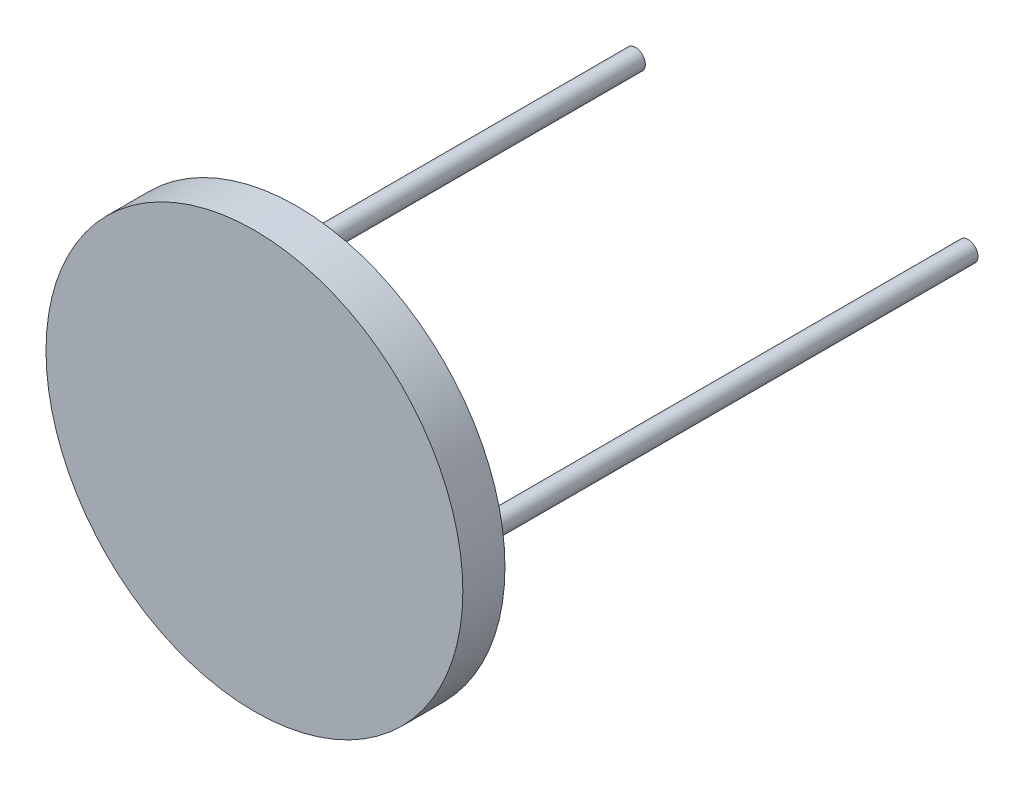
ISO-10303-21;
HEADER;
FILE_DESCRIPTION(('STEP AP214'),'2;1');
FILE_NAME('part.step','',(''),(''),'','','');
FILE_SCHEMA(('AUTOMOTIVE_DESIGN { 1 0 10303 214 1 1 1 1 }'));
ENDSEC;
DATA;
#1=APPLICATION_CONTEXT('core data for automotive mechanical design processes');
#2=APPLICATION_PROTOCOL_DEFINITION('international standard','automotive_design',2000,#1);
#3=PRODUCT_CONTEXT('',#1,'mechanical');
#4=PRODUCT('Part','Part','',(#3));
#5=PRODUCT_RELATED_PRODUCT_CATEGORY('part','',(#4));
#6=PRODUCT_DEFINITION_FORMATION('','',#4);
#7=PRODUCT_DEFINITION_CONTEXT('part definition',#1,'design');
#8=PRODUCT_DEFINITION('design','',#6,#7);
#9=PRODUCT_DEFINITION_SHAPE('','',#8);
#10=(LENGTH_UNIT() NAMED_UNIT(*) SI_UNIT(.MILLI.,.METRE.));
#11=(NAMED_UNIT(*) PLANE_ANGLE_UNIT() SI_UNIT($,.RADIAN.));
#12=(NAMED_UNIT(*) SI_UNIT($,.STERADIAN.) SOLID_ANGLE_UNIT());
#13=UNCERTAINTY_MEASURE_WITH_UNIT(LENGTH_MEASURE(1.E-05),#10,'distance_accuracy_value','');
#14=(GEOMETRIC_REPRESENTATION_CONTEXT(3) GLOBAL_UNCERTAINTY_ASSIGNED_CONTEXT((#13)) GLOBAL_UNIT_ASSIGNED_CONTEXT((#10,
#11,#12)) REPRESENTATION_CONTEXT('',''));
#15=CARTESIAN_POINT('',(0.,0.,0.));
#16=DIRECTION('',(0.,0.,1.));
#17=DIRECTION('',(1.,0.,0.));
#18=AXIS2_PLACEMENT_3D('',#15,#16,#17);
#19=CARTESIAN_POINT('',(0.,0.,2.));
#20=DIRECTION('',(0.,0.,-1.));
#21=DIRECTION('',(-1.,0.,0.));
#22=AXIS2_PLACEMENT_3D('',#19,#20,#21);
#23=CYLINDRICAL_SURFACE('',#22,9.9);
#24=CARTESIAN_POINT('',(0.,0.,2.));
#25=DIRECTION('',(0.,0.,1.));
#26=DIRECTION('',(1.,0.,0.));
#27=AXIS2_PLACEMENT_3D('',#24,#25,#26);
#28=CIRCLE('',#27,9.9);
#29=CARTESIAN_POINT('',(9.9,0.,2.));
#30=VERTEX_POINT('',#29);
#31=EDGE_CURVE('E49',#30,#30,#28,.T.);
#32=ORIENTED_EDGE('',*,*,#31,.F.);
#33=EDGE_LOOP('',(#32));
#34=FACE_BOUND('',#33,.T.);
#35=CARTESIAN_POINT('',(0.,0.,0.));
#36=DIRECTION('',(0.,0.,1.));
#37=DIRECTION('',(1.,0.,0.));
#38=AXIS2_PLACEMENT_3D('',#35,#36,#37);
#39=CIRCLE('',#38,9.9);
#40=CARTESIAN_POINT('',(9.9,0.,0.));
#41=VERTEX_POINT('',#40);
#42=EDGE_CURVE('E53',#41,#41,#39,.T.);
#43=ORIENTED_EDGE('',*,*,#42,.T.);
#44=EDGE_LOOP('',(#43));
#45=FACE_BOUND('',#44,.T.);
#46=ADVANCED_FACE('F39',(#34,#45),#23,.T.);
#47=CARTESIAN_POINT('',(0.,0.,2.));
#48=DIRECTION('',(0.,0.,1.));
#49=DIRECTION('',(1.,0.,0.));
#50=AXIS2_PLACEMENT_3D('',#47,#48,#49);
#51=PLANE('',#50);
#52=ORIENTED_EDGE('',*,*,#31,.T.);
#53=EDGE_LOOP('',(#52));
#54=FACE_BOUND('',#53,.T.);
#55=ADVANCED_FACE('F80',(#54),#51,.T.);
#56=CARTESIAN_POINT('',(0.,0.,0.));
#57=DIRECTION('',(0.,0.,1.));
#58=DIRECTION('',(1.,0.,0.));
#59=AXIS2_PLACEMENT_3D('',#56,#57,#58);
#60=PLANE('',#59);
#61=CARTESIAN_POINT('',(-7.9,0.,0.));
#62=DIRECTION('',(0.,0.,1.));
#63=DIRECTION('',(1.,0.,0.));
#64=AXIS2_PLACEMENT_3D('',#61,#62,#63);
#65=CIRCLE('',#64,0.47);
#66=CARTESIAN_POINT('',(-7.43,0.,0.));
#67=VERTEX_POINT('',#66);
#68=EDGE_CURVE('E10',#67,#67,#65,.F.);
#69=ORIENTED_EDGE('',*,*,#68,.F.);
#70=EDGE_LOOP('',(#69));
#71=FACE_BOUND('',#70,.T.);
#72=CARTESIAN_POINT('',(7.9,0.,0.));
#73=DIRECTION('',(0.,0.,1.));
#74=DIRECTION('',(1.,0.,0.));
#75=AXIS2_PLACEMENT_3D('',#72,#73,#74);
#76=CIRCLE('',#75,0.47);
#77=CARTESIAN_POINT('',(8.37,0.,0.));
#78=VERTEX_POINT('',#77);
#79=EDGE_CURVE('E45',#78,#78,#76,.F.);
#80=ORIENTED_EDGE('',*,*,#79,.F.);
#81=EDGE_LOOP('',(#80));
#82=FACE_BOUND('',#81,.T.);
#83=ORIENTED_EDGE('',*,*,#42,.F.);
#84=EDGE_LOOP('',(#83));
#85=FACE_BOUND('',#84,.T.);
#86=ADVANCED_FACE('F85',(#71,#82,#85),#60,.F.);
#87=CARTESIAN_POINT('',(7.9,0.,-24.));
#88=DIRECTION('',(0.,0.,1.));
#89=DIRECTION('',(1.,0.,0.));
#90=AXIS2_PLACEMENT_3D('',#87,#88,#89);
#91=CYLINDRICAL_SURFACE('',#90,0.47);
#92=CARTESIAN_POINT('',(7.9,0.,-24.));
#93=DIRECTION('',(0.,0.,-1.));
#94=DIRECTION('',(-1.,0.,0.));
#95=AXIS2_PLACEMENT_3D('',#92,#93,#94);
#96=CIRCLE('',#95,0.47);
#97=CARTESIAN_POINT('',(7.43,0.,-24.));
#98=VERTEX_POINT('',#97);
#99=EDGE_CURVE('E57',#98,#98,#96,.T.);
#100=ORIENTED_EDGE('',*,*,#99,.F.);
#101=EDGE_LOOP('',(#100));
#102=FACE_BOUND('',#101,.T.);
#103=ORIENTED_EDGE('',*,*,#79,.T.);
#104=EDGE_LOOP('',(#103));
#105=FACE_BOUND('',#104,.T.);
#106=ADVANCED_FACE('F76',(#102,#105),#91,.T.);
#107=CARTESIAN_POINT('',(7.9,0.,-24.));
#108=DIRECTION('',(0.,0.,-1.));
#109=DIRECTION('',(-1.,0.,0.));
#110=AXIS2_PLACEMENT_3D('',#107,#108,#109);
#111=PLANE('',#110);
#112=ORIENTED_EDGE('',*,*,#99,.T.);
#113=EDGE_LOOP('',(#112));
#114=FACE_BOUND('',#113,.T.);
#115=ADVANCED_FACE('F69',(#114),#111,.T.);
#116=CARTESIAN_POINT('',(-7.9,0.,-24.));
#117=DIRECTION('',(0.,0.,1.));
#118=DIRECTION('',(1.,0.,0.));
#119=AXIS2_PLACEMENT_3D('',#116,#117,#118);
#120=CYLINDRICAL_SURFACE('',#119,0.47);
#121=CARTESIAN_POINT('',(-7.9,0.,-24.));
#122=DIRECTION('',(0.,0.,-1.));
#123=DIRECTION('',(-1.,0.,0.));
#124=AXIS2_PLACEMENT_3D('',#121,#122,#123);
#125=CIRCLE('',#124,0.47);
#126=CARTESIAN_POINT('',(-8.37,0.,-24.));
#127=VERTEX_POINT('',#126);
#128=EDGE_CURVE('E61',#127,#127,#125,.T.);
#129=ORIENTED_EDGE('',*,*,#128,.F.);
#130=EDGE_LOOP('',(#129));
#131=FACE_BOUND('',#130,.T.);
#132=ORIENTED_EDGE('',*,*,#68,.T.);
#133=EDGE_LOOP('',(#132));
#134=FACE_BOUND('',#133,.T.);
#135=ADVANCED_FACE('F67',(#131,#134),#120,.T.);
#136=CARTESIAN_POINT('',(-7.9,0.,-24.));
#137=DIRECTION('',(0.,0.,-1.));
#138=DIRECTION('',(-1.,0.,0.));
#139=AXIS2_PLACEMENT_3D('',#136,#137,#138);
#140=PLANE('',#139);
#141=ORIENTED_EDGE('',*,*,#128,.T.);
#142=EDGE_LOOP('',(#141));
#143=FACE_BOUND('',#142,.T.);
#144=ADVANCED_FACE('F65',(#143),#140,.T.);
#145=CLOSED_SHELL('',(#46,#55,#86,#106,#115,#135,#144));
#146=MANIFOLD_SOLID_BREP('B2',#145);
#147=ADVANCED_BREP_SHAPE_REPRESENTATION('',(#18,#146),#14);
#148=SHAPE_DEFINITION_REPRESENTATION(#9,#147);
ENDSEC;
END-ISO-10303-21;
